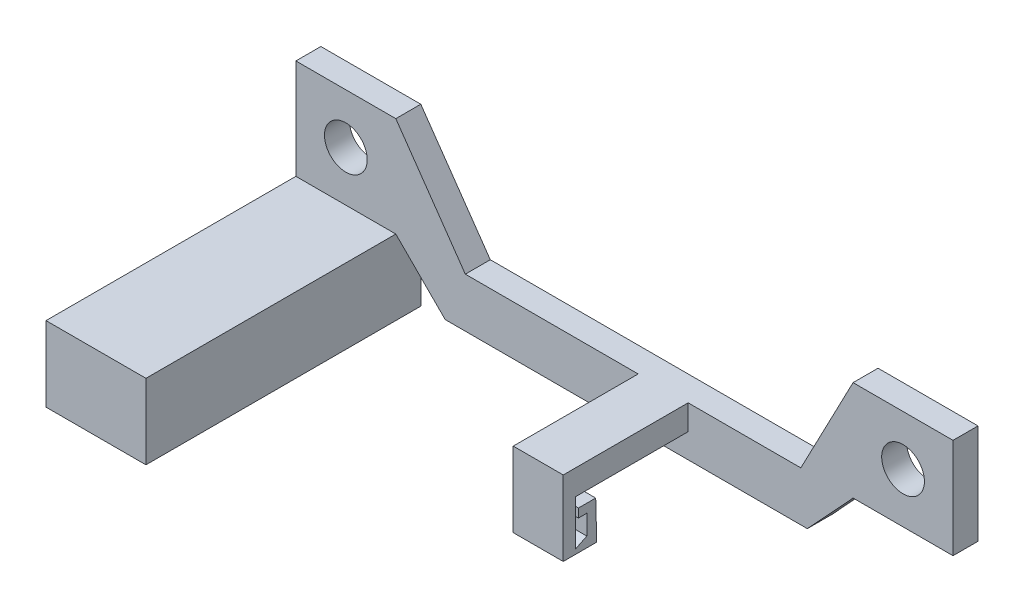
ISO-10303-21;
HEADER;
FILE_DESCRIPTION(('STEP AP214'),'2;1');
FILE_NAME('part.step','',(''),(''),'','','');
FILE_SCHEMA(('AUTOMOTIVE_DESIGN { 1 0 10303 214 1 1 1 1 }'));
ENDSEC;
DATA;
#1=APPLICATION_CONTEXT('core data for automotive mechanical design processes');
#2=APPLICATION_PROTOCOL_DEFINITION('international standard','automotive_design',2000,#1);
#3=PRODUCT_CONTEXT('',#1,'mechanical');
#4=PRODUCT('Part','Part','',(#3));
#5=PRODUCT_RELATED_PRODUCT_CATEGORY('part','',(#4));
#6=PRODUCT_DEFINITION_FORMATION('','',#4);
#7=PRODUCT_DEFINITION_CONTEXT('part definition',#1,'design');
#8=PRODUCT_DEFINITION('design','',#6,#7);
#9=PRODUCT_DEFINITION_SHAPE('','',#8);
#10=(LENGTH_UNIT() NAMED_UNIT(*) SI_UNIT(.MILLI.,.METRE.));
#11=(NAMED_UNIT(*) PLANE_ANGLE_UNIT() SI_UNIT($,.RADIAN.));
#12=(NAMED_UNIT(*) SI_UNIT($,.STERADIAN.) SOLID_ANGLE_UNIT());
#13=UNCERTAINTY_MEASURE_WITH_UNIT(LENGTH_MEASURE(1.E-05),#10,'distance_accuracy_value','');
#14=(GEOMETRIC_REPRESENTATION_CONTEXT(3) GLOBAL_UNCERTAINTY_ASSIGNED_CONTEXT((#13)) GLOBAL_UNIT_ASSIGNED_CONTEXT((#10,
#11,#12)) REPRESENTATION_CONTEXT('',''));
#15=CARTESIAN_POINT('',(0.,0.,0.));
#16=DIRECTION('',(0.,0.,1.));
#17=DIRECTION('',(1.,0.,0.));
#18=AXIS2_PLACEMENT_3D('',#15,#16,#17);
#19=CARTESIAN_POINT('',(0.,0.,2.54));
#20=DIRECTION('',(0.,0.,1.));
#21=DIRECTION('',(1.,0.,0.));
#22=AXIS2_PLACEMENT_3D('',#19,#20,#21);
#23=PLANE('',#22);
#24=CARTESIAN_POINT('',(56.642,0.,2.54));
#25=DIRECTION('',(0.,0.,1.));
#26=DIRECTION('',(1.,0.,0.));
#27=AXIS2_PLACEMENT_3D('',#24,#25,#26);
#28=CIRCLE('',#27,2.1717);
#29=CARTESIAN_POINT('',(58.8137,0.,2.54));
#30=VERTEX_POINT('',#29);
#31=EDGE_CURVE('E198',#30,#30,#28,.T.);
#32=ORIENTED_EDGE('',*,*,#31,.F.);
#33=EDGE_LOOP('',(#32));
#34=FACE_BOUND('',#33,.T.);
#35=CARTESIAN_POINT('',(0.,0.,2.54));
#36=DIRECTION('',(0.,0.,1.));
#37=DIRECTION('',(1.,0.,0.));
#38=AXIS2_PLACEMENT_3D('',#35,#36,#37);
#39=CIRCLE('',#38,2.1717);
#40=CARTESIAN_POINT('',(2.1717,0.,2.54));
#41=VERTEX_POINT('',#40);
#42=EDGE_CURVE('E292',#41,#41,#39,.T.);
#43=ORIENTED_EDGE('',*,*,#42,.F.);
#44=EDGE_LOOP('',(#43));
#45=FACE_BOUND('',#44,.T.);
#46=DIRECTION('',(1.,0.,0.));
#47=VECTOR('',#46,1.);
#48=CARTESIAN_POINT('',(0.,-5.08,2.54));
#49=LINE('',#48,#47);
#50=CARTESIAN_POINT('',(34.798,-5.08,2.54));
#51=VERTEX_POINT('',#50);
#52=CARTESIAN_POINT('',(46.2523899359759,-5.08,2.54));
#53=VERTEX_POINT('',#52);
#54=EDGE_CURVE('E241',#51,#53,#49,.T.);
#55=ORIENTED_EDGE('',*,*,#54,.F.);
#56=DIRECTION('',(0.,1.,0.));
#57=VECTOR('',#56,1.);
#58=CARTESIAN_POINT('',(34.798,0.,2.54));
#59=LINE('',#58,#57);
#60=CARTESIAN_POINT('',(34.798,-7.62,2.54));
#61=VERTEX_POINT('',#60);
#62=EDGE_CURVE('E469',#61,#51,#59,.T.);
#63=ORIENTED_EDGE('',*,*,#62,.F.);
#64=DIRECTION('',(1.,0.,0.));
#65=VECTOR('',#64,1.);
#66=CARTESIAN_POINT('',(0.,-7.62,2.54));
#67=LINE('',#66,#65);
#68=CARTESIAN_POINT('',(29.718,-7.62,2.54));
#69=VERTEX_POINT('',#68);
#70=EDGE_CURVE('E448',#69,#61,#67,.T.);
#71=ORIENTED_EDGE('',*,*,#70,.F.);
#72=DIRECTION('',(0.,-1.,0.));
#73=VECTOR('',#72,1.);
#74=CARTESIAN_POINT('',(29.718,0.,2.54));
#75=LINE('',#74,#73);
#76=CARTESIAN_POINT('',(29.718,-5.08,2.54));
#77=VERTEX_POINT('',#76);
#78=EDGE_CURVE('E465',#77,#69,#75,.T.);
#79=ORIENTED_EDGE('',*,*,#78,.F.);
#80=CARTESIAN_POINT('',(12.1453135079042,-5.08,2.54));
#81=VERTEX_POINT('',#80);
#82=EDGE_CURVE('E150',#81,#77,#49,.T.);
#83=ORIENTED_EDGE('',*,*,#82,.F.);
#84=DIRECTION('',(0.570927658436511,-0.821000370786885,0.));
#85=VECTOR('',#84,1.);
#86=CARTESIAN_POINT('',(5.80528901475342,4.03702626901824,2.54));
#87=LINE('',#86,#85);
#88=CARTESIAN_POINT('',(5.08,5.08,2.54));
#89=VERTEX_POINT('',#88);
#90=EDGE_CURVE('E133',#89,#81,#87,.T.);
#91=ORIENTED_EDGE('',*,*,#90,.F.);
#92=DIRECTION('',(1.,0.,0.));
#93=VECTOR('',#92,1.);
#94=CARTESIAN_POINT('',(0.,5.08,2.54));
#95=LINE('',#94,#93);
#96=CARTESIAN_POINT('',(-5.08,5.08,2.54));
#97=VERTEX_POINT('',#96);
#98=EDGE_CURVE('E147',#97,#89,#95,.T.);
#99=ORIENTED_EDGE('',*,*,#98,.F.);
#100=DIRECTION('',(0.,1.,0.));
#101=VECTOR('',#100,1.);
#102=CARTESIAN_POINT('',(-5.08,0.,2.54));
#103=LINE('',#102,#101);
#104=CARTESIAN_POINT('',(-5.08,-5.08,2.54));
#105=VERTEX_POINT('',#104);
#106=EDGE_CURVE('E153',#105,#97,#103,.T.);
#107=ORIENTED_EDGE('',*,*,#106,.F.);
#108=DIRECTION('',(-1.,0.,0.));
#109=VECTOR('',#108,1.);
#110=CARTESIAN_POINT('',(0.,-5.08,2.54));
#111=LINE('',#110,#109);
#112=CARTESIAN_POINT('',(5.08,-5.08,2.54));
#113=VERTEX_POINT('',#112);
#114=EDGE_CURVE('E155',#113,#105,#111,.T.);
#115=ORIENTED_EDGE('',*,*,#114,.F.);
#116=DIRECTION('',(0.707106781186556,-0.707106781186539,0.));
#117=VECTOR('',#116,1.);
#118=CARTESIAN_POINT('',(0.,0.,2.54));
#119=LINE('',#118,#117);
#120=CARTESIAN_POINT('',(10.102114398568,-10.1021143985678,2.54));
#121=VERTEX_POINT('',#120);
#122=EDGE_CURVE('E59',#113,#121,#119,.T.);
#123=ORIENTED_EDGE('',*,*,#122,.T.);
#124=DIRECTION('',(1.,0.,0.));
#125=VECTOR('',#124,1.);
#126=CARTESIAN_POINT('',(0.,-10.1021143985678,2.54));
#127=LINE('',#126,#125);
#128=CARTESIAN_POINT('',(46.9108277048577,-10.1021143985678,2.54));
#129=VERTEX_POINT('',#128);
#130=EDGE_CURVE('E234',#121,#129,#127,.T.);
#131=ORIENTED_EDGE('',*,*,#130,.T.);
#132=DIRECTION('',(0.679491903281779,0.733683006055412,0.));
#133=VECTOR('',#132,1.);
#134=CARTESIAN_POINT('',(30.2878886694219,-28.0507725387029,2.54));
#135=LINE('',#134,#133);
#136=CARTESIAN_POINT('',(51.562,-5.08,2.54));
#137=VERTEX_POINT('',#136);
#138=EDGE_CURVE('E107',#129,#137,#135,.T.);
#139=ORIENTED_EDGE('',*,*,#138,.T.);
#140=DIRECTION('',(-1.,0.,0.));
#141=VECTOR('',#140,1.);
#142=CARTESIAN_POINT('',(0.,-5.08000000000001,2.54));
#143=LINE('',#142,#141);
#144=CARTESIAN_POINT('',(61.722,-5.08,2.54));
#145=VERTEX_POINT('',#144);
#146=EDGE_CURVE('E216',#145,#137,#143,.T.);
#147=ORIENTED_EDGE('',*,*,#146,.F.);
#148=DIRECTION('',(0.,-1.,0.));
#149=VECTOR('',#148,1.);
#150=CARTESIAN_POINT('',(61.722,0.,2.54));
#151=LINE('',#150,#149);
#152=CARTESIAN_POINT('',(61.722,5.08,2.54));
#153=VERTEX_POINT('',#152);
#154=EDGE_CURVE('E228',#153,#145,#151,.T.);
#155=ORIENTED_EDGE('',*,*,#154,.F.);
#156=DIRECTION('',(1.,0.,0.));
#157=VECTOR('',#156,1.);
#158=CARTESIAN_POINT('',(0.,5.08,2.54));
#159=LINE('',#158,#157);
#160=CARTESIAN_POINT('',(51.562,5.08,2.54));
#161=VERTEX_POINT('',#160);
#162=EDGE_CURVE('E232',#161,#153,#159,.T.);
#163=ORIENTED_EDGE('',*,*,#162,.F.);
#164=DIRECTION('',(0.463165209084895,0.886271961134586,0.));
#165=VECTOR('',#164,1.);
#166=CARTESIAN_POINT('',(38.4155251556514,-20.0759310020882,2.54));
#167=LINE('',#166,#165);
#168=EDGE_CURVE('E239',#53,#161,#167,.T.);
#169=ORIENTED_EDGE('',*,*,#168,.F.);
#170=EDGE_LOOP('',(#55,#63,#71,#79,#83,#91,#99,#107,#115,#123,#131,#139,#147,#155,#163,#169));
#171=FACE_BOUND('',#170,.T.);
#172=ADVANCED_FACE('F35',(#34,#45,#171),#23,.T.);
#173=CARTESIAN_POINT('',(0.,-10.1021143985678,2.54));
#174=DIRECTION('',(0.,1.,0.));
#175=DIRECTION('',(0.,0.,1.));
#176=AXIS2_PLACEMENT_3D('',#173,#174,#175);
#177=PLANE('',#176);
#178=DIRECTION('',(1.,0.,0.));
#179=VECTOR('',#178,1.);
#180=CARTESIAN_POINT('',(0.,-10.1021143985678,0.));
#181=LINE('',#180,#179);
#182=CARTESIAN_POINT('',(10.102114398568,-10.1021143985678,0.));
#183=VERTEX_POINT('',#182);
#184=CARTESIAN_POINT('',(46.9108277048577,-10.1021143985678,0.));
#185=VERTEX_POINT('',#184);
#186=EDGE_CURVE('E170',#183,#185,#181,.T.);
#187=ORIENTED_EDGE('',*,*,#186,.T.);
#188=DIRECTION('',(0.,0.,-1.));
#189=VECTOR('',#188,1.);
#190=CARTESIAN_POINT('',(46.9108277048577,-10.1021143985678,2.54));
#191=LINE('',#190,#189);
#192=EDGE_CURVE('E11',#129,#185,#191,.T.);
#193=ORIENTED_EDGE('',*,*,#192,.F.);
#194=ORIENTED_EDGE('',*,*,#130,.F.);
#195=DIRECTION('',(0.,0.,-1.));
#196=VECTOR('',#195,1.);
#197=CARTESIAN_POINT('',(10.102114398568,-10.1021143985678,2.54));
#198=LINE('',#197,#196);
#199=EDGE_CURVE('E162',#121,#183,#198,.T.);
#200=ORIENTED_EDGE('',*,*,#199,.T.);
#201=EDGE_LOOP('',(#187,#193,#194,#200));
#202=FACE_BOUND('',#201,.T.);
#203=ADVANCED_FACE('F296',(#202),#177,.F.);
#204=CARTESIAN_POINT('',(30.2878886694219,-28.0507725387029,2.54));
#205=DIRECTION('',(-0.733683006055412,0.679491903281779,0.));
#206=DIRECTION('',(-0.679491903281779,-0.733683006055412,0.));
#207=AXIS2_PLACEMENT_3D('',#204,#205,#206);
#208=PLANE('',#207);
#209=DIRECTION('',(0.679491903281779,0.733683006055412,0.));
#210=VECTOR('',#209,1.);
#211=CARTESIAN_POINT('',(30.2878886694219,-28.0507725387029,0.));
#212=LINE('',#211,#210);
#213=CARTESIAN_POINT('',(51.562,-5.08,0.));
#214=VERTEX_POINT('',#213);
#215=EDGE_CURVE('E173',#185,#214,#212,.T.);
#216=ORIENTED_EDGE('',*,*,#215,.T.);
#217=DIRECTION('',(0.,0.,-1.));
#218=VECTOR('',#217,1.);
#219=CARTESIAN_POINT('',(51.562,-5.08,2.54));
#220=LINE('',#219,#218);
#221=EDGE_CURVE('E43',#137,#214,#220,.T.);
#222=ORIENTED_EDGE('',*,*,#221,.F.);
#223=ORIENTED_EDGE('',*,*,#138,.F.);
#224=ORIENTED_EDGE('',*,*,#192,.T.);
#225=EDGE_LOOP('',(#216,#222,#223,#224));
#226=FACE_BOUND('',#225,.T.);
#227=ADVANCED_FACE('F217',(#226),#208,.F.);
#228=CARTESIAN_POINT('',(0.,-5.08000000000001,2.54));
#229=DIRECTION('',(0.,-1.,0.));
#230=DIRECTION('',(1.,0.,0.));
#231=AXIS2_PLACEMENT_3D('',#228,#229,#230);
#232=PLANE('',#231);
#233=DIRECTION('',(-1.,0.,0.));
#234=VECTOR('',#233,1.);
#235=CARTESIAN_POINT('',(0.,-5.08000000000001,0.));
#236=LINE('',#235,#234);
#237=CARTESIAN_POINT('',(61.722,-5.08,0.));
#238=VERTEX_POINT('',#237);
#239=EDGE_CURVE('E176',#238,#214,#236,.T.);
#240=ORIENTED_EDGE('',*,*,#239,.F.);
#241=DIRECTION('',(0.,0.,-1.));
#242=VECTOR('',#241,1.);
#243=CARTESIAN_POINT('',(61.722,-5.08,2.54));
#244=LINE('',#243,#242);
#245=EDGE_CURVE('E210',#145,#238,#244,.T.);
#246=ORIENTED_EDGE('',*,*,#245,.F.);
#247=ORIENTED_EDGE('',*,*,#146,.T.);
#248=ORIENTED_EDGE('',*,*,#221,.T.);
#249=EDGE_LOOP('',(#240,#246,#247,#248));
#250=FACE_BOUND('',#249,.T.);
#251=ADVANCED_FACE('F214',(#250),#232,.T.);
#252=CARTESIAN_POINT('',(61.722,0.,2.54));
#253=DIRECTION('',(1.,0.,0.));
#254=DIRECTION('',(0.,0.,-1.));
#255=AXIS2_PLACEMENT_3D('',#252,#253,#254);
#256=PLANE('',#255);
#257=DIRECTION('',(0.,-1.,0.));
#258=VECTOR('',#257,1.);
#259=CARTESIAN_POINT('',(61.722,0.,0.));
#260=LINE('',#259,#258);
#261=CARTESIAN_POINT('',(61.722,5.08,0.));
#262=VERTEX_POINT('',#261);
#263=EDGE_CURVE('E179',#262,#238,#260,.T.);
#264=ORIENTED_EDGE('',*,*,#263,.F.);
#265=DIRECTION('',(0.,0.,-1.));
#266=VECTOR('',#265,1.);
#267=CARTESIAN_POINT('',(61.722,5.08,2.54));
#268=LINE('',#267,#266);
#269=EDGE_CURVE('E208',#153,#262,#268,.T.);
#270=ORIENTED_EDGE('',*,*,#269,.F.);
#271=ORIENTED_EDGE('',*,*,#154,.T.);
#272=ORIENTED_EDGE('',*,*,#245,.T.);
#273=EDGE_LOOP('',(#264,#270,#271,#272));
#274=FACE_BOUND('',#273,.T.);
#275=ADVANCED_FACE('F225',(#274),#256,.T.);
#276=CARTESIAN_POINT('',(0.,5.08,2.54));
#277=DIRECTION('',(0.,1.,0.));
#278=DIRECTION('',(0.,0.,1.));
#279=AXIS2_PLACEMENT_3D('',#276,#277,#278);
#280=PLANE('',#279);
#281=DIRECTION('',(1.,0.,0.));
#282=VECTOR('',#281,1.);
#283=CARTESIAN_POINT('',(0.,5.08,0.));
#284=LINE('',#283,#282);
#285=CARTESIAN_POINT('',(51.562,5.08,0.));
#286=VERTEX_POINT('',#285);
#287=EDGE_CURVE('E182',#286,#262,#284,.T.);
#288=ORIENTED_EDGE('',*,*,#287,.F.);
#289=DIRECTION('',(0.,0.,-1.));
#290=VECTOR('',#289,1.);
#291=CARTESIAN_POINT('',(51.562,5.08,2.54));
#292=LINE('',#291,#290);
#293=EDGE_CURVE('E206',#161,#286,#292,.T.);
#294=ORIENTED_EDGE('',*,*,#293,.F.);
#295=ORIENTED_EDGE('',*,*,#162,.T.);
#296=ORIENTED_EDGE('',*,*,#269,.T.);
#297=EDGE_LOOP('',(#288,#294,#295,#296));
#298=FACE_BOUND('',#297,.T.);
#299=ADVANCED_FACE('F257',(#298),#280,.T.);
#300=CARTESIAN_POINT('',(38.4155251556514,-20.0759310020882,2.54));
#301=DIRECTION('',(-0.886271961134586,0.463165209084895,0.));
#302=DIRECTION('',(-0.463165209084895,-0.886271961134586,0.));
#303=AXIS2_PLACEMENT_3D('',#300,#301,#302);
#304=PLANE('',#303);
#305=DIRECTION('',(0.463165209084895,0.886271961134586,0.));
#306=VECTOR('',#305,1.);
#307=CARTESIAN_POINT('',(38.4155251556514,-20.0759310020882,0.));
#308=LINE('',#307,#306);
#309=CARTESIAN_POINT('',(46.2523899359759,-5.08,0.));
#310=VERTEX_POINT('',#309);
#311=EDGE_CURVE('E185',#310,#286,#308,.T.);
#312=ORIENTED_EDGE('',*,*,#311,.F.);
#313=DIRECTION('',(0.,0.,-1.));
#314=VECTOR('',#313,1.);
#315=CARTESIAN_POINT('',(46.2523899359759,-5.08,2.54));
#316=LINE('',#315,#314);
#317=EDGE_CURVE('E204',#53,#310,#316,.T.);
#318=ORIENTED_EDGE('',*,*,#317,.F.);
#319=ORIENTED_EDGE('',*,*,#168,.T.);
#320=ORIENTED_EDGE('',*,*,#293,.T.);
#321=EDGE_LOOP('',(#312,#318,#319,#320));
#322=FACE_BOUND('',#321,.T.);
#323=ADVANCED_FACE('F255',(#322),#304,.T.);
#324=CARTESIAN_POINT('',(0.,-5.08,2.54));
#325=DIRECTION('',(0.,1.,0.));
#326=DIRECTION('',(-1.,0.,0.));
#327=AXIS2_PLACEMENT_3D('',#324,#325,#326);
#328=PLANE('',#327);
#329=DIRECTION('',(1.,0.,0.));
#330=VECTOR('',#329,1.);
#331=CARTESIAN_POINT('',(0.,-5.08,0.));
#332=LINE('',#331,#330);
#333=CARTESIAN_POINT('',(12.1453135079042,-5.08,0.));
#334=VERTEX_POINT('',#333);
#335=EDGE_CURVE('E188',#334,#310,#332,.T.);
#336=ORIENTED_EDGE('',*,*,#335,.F.);
#337=DIRECTION('',(0.,0.,-1.));
#338=VECTOR('',#337,1.);
#339=CARTESIAN_POINT('',(12.1453135079042,-5.08,2.54));
#340=LINE('',#339,#338);
#341=EDGE_CURVE('E140',#81,#334,#340,.T.);
#342=ORIENTED_EDGE('',*,*,#341,.F.);
#343=ORIENTED_EDGE('',*,*,#82,.T.);
#344=DIRECTION('',(0.,0.,-1.));
#345=VECTOR('',#344,1.);
#346=CARTESIAN_POINT('',(29.718,-5.08,15.24));
#347=LINE('',#346,#345);
#348=CARTESIAN_POINT('',(29.718,-5.08,15.24));
#349=VERTEX_POINT('',#348);
#350=EDGE_CURVE('E50',#349,#77,#347,.T.);
#351=ORIENTED_EDGE('',*,*,#350,.F.);
#352=DIRECTION('',(-1.,0.,0.));
#353=VECTOR('',#352,1.);
#354=CARTESIAN_POINT('',(0.,-5.08,15.24));
#355=LINE('',#354,#353);
#356=CARTESIAN_POINT('',(34.798,-5.08,15.24));
#357=VERTEX_POINT('',#356);
#358=EDGE_CURVE('E386',#357,#349,#355,.T.);
#359=ORIENTED_EDGE('',*,*,#358,.F.);
#360=DIRECTION('',(0.,0.,-1.));
#361=VECTOR('',#360,1.);
#362=CARTESIAN_POINT('',(34.798,-5.08,15.24));
#363=LINE('',#362,#361);
#364=EDGE_CURVE('E251',#357,#51,#363,.T.);
#365=ORIENTED_EDGE('',*,*,#364,.T.);
#366=ORIENTED_EDGE('',*,*,#54,.T.);
#367=ORIENTED_EDGE('',*,*,#317,.T.);
#368=EDGE_LOOP('',(#336,#342,#343,#351,#359,#365,#366,#367));
#369=FACE_BOUND('',#368,.T.);
#370=ADVANCED_FACE('F246',(#369),#328,.T.);
#371=CARTESIAN_POINT('',(5.80528901475342,4.03702626901824,2.54));
#372=DIRECTION('',(0.821000370786885,0.570927658436511,0.));
#373=DIRECTION('',(-0.570927658436511,0.821000370786885,0.));
#374=AXIS2_PLACEMENT_3D('',#371,#372,#373);
#375=PLANE('',#374);
#376=DIRECTION('',(0.570927658436511,-0.821000370786885,0.));
#377=VECTOR('',#376,1.);
#378=CARTESIAN_POINT('',(5.80528901475342,4.03702626901824,0.));
#379=LINE('',#378,#377);
#380=CARTESIAN_POINT('',(5.08,5.08,0.));
#381=VERTEX_POINT('',#380);
#382=EDGE_CURVE('E135',#381,#334,#379,.T.);
#383=ORIENTED_EDGE('',*,*,#382,.F.);
#384=DIRECTION('',(0.,0.,-1.));
#385=VECTOR('',#384,1.);
#386=CARTESIAN_POINT('',(5.08,5.08,2.54));
#387=LINE('',#386,#385);
#388=EDGE_CURVE('E130',#89,#381,#387,.T.);
#389=ORIENTED_EDGE('',*,*,#388,.F.);
#390=ORIENTED_EDGE('',*,*,#90,.T.);
#391=ORIENTED_EDGE('',*,*,#341,.T.);
#392=EDGE_LOOP('',(#383,#389,#390,#391));
#393=FACE_BOUND('',#392,.T.);
#394=ADVANCED_FACE('F132',(#393),#375,.T.);
#395=CARTESIAN_POINT('',(0.,5.08,2.54));
#396=DIRECTION('',(0.,1.,0.));
#397=DIRECTION('',(0.,0.,1.));
#398=AXIS2_PLACEMENT_3D('',#395,#396,#397);
#399=PLANE('',#398);
#400=DIRECTION('',(1.,0.,0.));
#401=VECTOR('',#400,1.);
#402=CARTESIAN_POINT('',(0.,5.08,0.));
#403=LINE('',#402,#401);
#404=CARTESIAN_POINT('',(-5.08,5.08,0.));
#405=VERTEX_POINT('',#404);
#406=EDGE_CURVE('E192',#405,#381,#403,.T.);
#407=ORIENTED_EDGE('',*,*,#406,.F.);
#408=DIRECTION('',(0.,0.,-1.));
#409=VECTOR('',#408,1.);
#410=CARTESIAN_POINT('',(-5.08,5.08,2.54));
#411=LINE('',#410,#409);
#412=EDGE_CURVE('E141',#97,#405,#411,.T.);
#413=ORIENTED_EDGE('',*,*,#412,.F.);
#414=ORIENTED_EDGE('',*,*,#98,.T.);
#415=ORIENTED_EDGE('',*,*,#388,.T.);
#416=EDGE_LOOP('',(#407,#413,#414,#415));
#417=FACE_BOUND('',#416,.T.);
#418=ADVANCED_FACE('F152',(#417),#399,.T.);
#419=CARTESIAN_POINT('',(-5.08,0.,2.54));
#420=DIRECTION('',(-1.,0.,0.));
#421=DIRECTION('',(0.,0.,1.));
#422=AXIS2_PLACEMENT_3D('',#419,#420,#421);
#423=PLANE('',#422);
#424=DIRECTION('',(0.,1.,0.));
#425=VECTOR('',#424,1.);
#426=CARTESIAN_POINT('',(-5.08,0.,0.));
#427=LINE('',#426,#425);
#428=CARTESIAN_POINT('',(-5.08,-12.7,0.));
#429=VERTEX_POINT('',#428);
#430=EDGE_CURVE('E194',#429,#405,#427,.T.);
#431=ORIENTED_EDGE('',*,*,#430,.F.);
#432=DIRECTION('',(0.,0.,1.));
#433=VECTOR('',#432,1.);
#434=CARTESIAN_POINT('',(-5.08,-12.7,0.));
#435=LINE('',#434,#433);
#436=CARTESIAN_POINT('',(-5.08,-12.7,27.94));
#437=VERTEX_POINT('',#436);
#438=EDGE_CURVE('E270',#429,#437,#435,.T.);
#439=ORIENTED_EDGE('',*,*,#438,.T.);
#440=DIRECTION('',(0.,-1.,0.));
#441=VECTOR('',#440,1.);
#442=CARTESIAN_POINT('',(-5.08,-5.08,27.94));
#443=LINE('',#442,#441);
#444=CARTESIAN_POINT('',(-5.08,-5.08,27.94));
#445=VERTEX_POINT('',#444);
#446=EDGE_CURVE('E480',#445,#437,#443,.T.);
#447=ORIENTED_EDGE('',*,*,#446,.F.);
#448=DIRECTION('',(0.,0.,1.));
#449=VECTOR('',#448,1.);
#450=CARTESIAN_POINT('',(-5.08,-5.08,0.));
#451=LINE('',#450,#449);
#452=EDGE_CURVE('E282',#105,#445,#451,.T.);
#453=ORIENTED_EDGE('',*,*,#452,.F.);
#454=ORIENTED_EDGE('',*,*,#106,.T.);
#455=ORIENTED_EDGE('',*,*,#412,.T.);
#456=EDGE_LOOP('',(#431,#439,#447,#453,#454,#455));
#457=FACE_BOUND('',#456,.T.);
#458=ADVANCED_FACE('F267',(#457),#423,.T.);
#459=CARTESIAN_POINT('',(0.,0.,2.54));
#460=DIRECTION('',(0.,0.,-1.));
#461=DIRECTION('',(-1.,0.,0.));
#462=AXIS2_PLACEMENT_3D('',#459,#460,#461);
#463=CYLINDRICAL_SURFACE('',#462,2.1717);
#464=ORIENTED_EDGE('',*,*,#42,.T.);
#465=EDGE_LOOP('',(#464));
#466=FACE_BOUND('',#465,.T.);
#467=CARTESIAN_POINT('',(0.,0.,0.));
#468=DIRECTION('',(0.,0.,1.));
#469=DIRECTION('',(1.,0.,0.));
#470=AXIS2_PLACEMENT_3D('',#467,#468,#469);
#471=CIRCLE('',#470,2.1717);
#472=CARTESIAN_POINT('',(2.1717,0.,0.));
#473=VERTEX_POINT('',#472);
#474=EDGE_CURVE('E166',#473,#473,#471,.T.);
#475=ORIENTED_EDGE('',*,*,#474,.F.);
#476=EDGE_LOOP('',(#475));
#477=FACE_BOUND('',#476,.T.);
#478=ADVANCED_FACE('F521',(#466,#477),#463,.F.);
#479=CARTESIAN_POINT('',(56.642,0.,2.54));
#480=DIRECTION('',(0.,0.,-1.));
#481=DIRECTION('',(-1.,0.,0.));
#482=AXIS2_PLACEMENT_3D('',#479,#480,#481);
#483=CYLINDRICAL_SURFACE('',#482,2.1717);
#484=ORIENTED_EDGE('',*,*,#31,.T.);
#485=EDGE_LOOP('',(#484));
#486=FACE_BOUND('',#485,.T.);
#487=CARTESIAN_POINT('',(56.642,0.,0.));
#488=DIRECTION('',(0.,0.,1.));
#489=DIRECTION('',(1.,0.,0.));
#490=AXIS2_PLACEMENT_3D('',#487,#488,#489);
#491=CIRCLE('',#490,2.1717);
#492=CARTESIAN_POINT('',(58.8137,0.,0.));
#493=VERTEX_POINT('',#492);
#494=EDGE_CURVE('E163',#493,#493,#491,.T.);
#495=ORIENTED_EDGE('',*,*,#494,.F.);
#496=EDGE_LOOP('',(#495));
#497=FACE_BOUND('',#496,.T.);
#498=ADVANCED_FACE('F37',(#486,#497),#483,.F.);
#499=CARTESIAN_POINT('',(0.,0.,2.54));
#500=DIRECTION('',(0.707106781186539,0.707106781186556,0.));
#501=DIRECTION('',(-0.707106781186556,0.707106781186539,0.));
#502=AXIS2_PLACEMENT_3D('',#499,#500,#501);
#503=PLANE('',#502);
#504=DIRECTION('',(0.707106781186556,-0.707106781186539,0.));
#505=VECTOR('',#504,1.);
#506=CARTESIAN_POINT('',(0.,0.,0.));
#507=LINE('',#506,#505);
#508=CARTESIAN_POINT('',(5.08,-5.08,0.));
#509=VERTEX_POINT('',#508);
#510=EDGE_CURVE('E99',#509,#183,#507,.T.);
#511=ORIENTED_EDGE('',*,*,#510,.T.);
#512=ORIENTED_EDGE('',*,*,#199,.F.);
#513=ORIENTED_EDGE('',*,*,#122,.F.);
#514=DIRECTION('',(0.,0.,-1.));
#515=VECTOR('',#514,1.);
#516=CARTESIAN_POINT('',(5.08,-5.08,2.54));
#517=LINE('',#516,#515);
#518=EDGE_CURVE('E200',#113,#509,#517,.T.);
#519=ORIENTED_EDGE('',*,*,#518,.T.);
#520=EDGE_LOOP('',(#511,#512,#513,#519));
#521=FACE_BOUND('',#520,.T.);
#522=ADVANCED_FACE('F503',(#521),#503,.F.);
#523=CARTESIAN_POINT('',(0.,0.,0.));
#524=DIRECTION('',(0.,0.,1.));
#525=DIRECTION('',(1.,0.,0.));
#526=AXIS2_PLACEMENT_3D('',#523,#524,#525);
#527=PLANE('',#526);
#528=ORIENTED_EDGE('',*,*,#494,.T.);
#529=EDGE_LOOP('',(#528));
#530=FACE_BOUND('',#529,.T.);
#531=ORIENTED_EDGE('',*,*,#474,.T.);
#532=EDGE_LOOP('',(#531));
#533=FACE_BOUND('',#532,.T.);
#534=ORIENTED_EDGE('',*,*,#186,.F.);
#535=ORIENTED_EDGE('',*,*,#510,.F.);
#536=DIRECTION('',(0.,1.,0.));
#537=VECTOR('',#536,1.);
#538=CARTESIAN_POINT('',(5.08,-12.7,0.));
#539=LINE('',#538,#537);
#540=CARTESIAN_POINT('',(5.08,-12.7,0.));
#541=VERTEX_POINT('',#540);
#542=EDGE_CURVE('E286',#541,#509,#539,.T.);
#543=ORIENTED_EDGE('',*,*,#542,.F.);
#544=DIRECTION('',(1.,0.,0.));
#545=VECTOR('',#544,1.);
#546=CARTESIAN_POINT('',(-5.08,-12.7,0.));
#547=LINE('',#546,#545);
#548=EDGE_CURVE('E263',#429,#541,#547,.T.);
#549=ORIENTED_EDGE('',*,*,#548,.F.);
#550=ORIENTED_EDGE('',*,*,#430,.T.);
#551=ORIENTED_EDGE('',*,*,#406,.T.);
#552=ORIENTED_EDGE('',*,*,#382,.T.);
#553=ORIENTED_EDGE('',*,*,#335,.T.);
#554=ORIENTED_EDGE('',*,*,#311,.T.);
#555=ORIENTED_EDGE('',*,*,#287,.T.);
#556=ORIENTED_EDGE('',*,*,#263,.T.);
#557=ORIENTED_EDGE('',*,*,#239,.T.);
#558=ORIENTED_EDGE('',*,*,#215,.F.);
#559=EDGE_LOOP('',(#534,#535,#543,#549,#550,#551,#552,#553,#554,#555,#556,#557,#558));
#560=FACE_BOUND('',#559,.T.);
#561=ADVANCED_FACE('F221',(#530,#533,#560),#527,.F.);
#562=CARTESIAN_POINT('',(5.08,-5.08,0.));
#563=DIRECTION('',(0.,1.,0.));
#564=DIRECTION('',(-1.,0.,0.));
#565=AXIS2_PLACEMENT_3D('',#562,#563,#564);
#566=PLANE('',#565);
#567=DIRECTION('',(0.,0.,1.));
#568=VECTOR('',#567,1.);
#569=CARTESIAN_POINT('',(5.08,-5.08,0.));
#570=LINE('',#569,#568);
#571=CARTESIAN_POINT('',(5.08,-5.08,27.94));
#572=VERTEX_POINT('',#571);
#573=EDGE_CURVE('E167',#113,#572,#570,.T.);
#574=ORIENTED_EDGE('',*,*,#573,.F.);
#575=ORIENTED_EDGE('',*,*,#114,.T.);
#576=ORIENTED_EDGE('',*,*,#452,.T.);
#577=DIRECTION('',(-1.,0.,0.));
#578=VECTOR('',#577,1.);
#579=CARTESIAN_POINT('',(5.08,-5.08,27.94));
#580=LINE('',#579,#578);
#581=EDGE_CURVE('E477',#572,#445,#580,.T.);
#582=ORIENTED_EDGE('',*,*,#581,.F.);
#583=EDGE_LOOP('',(#574,#575,#576,#582));
#584=FACE_BOUND('',#583,.T.);
#585=ADVANCED_FACE('F494',(#584),#566,.T.);
#586=CARTESIAN_POINT('',(5.08,-12.7,0.));
#587=DIRECTION('',(1.,0.,0.));
#588=DIRECTION('',(0.,1.,0.));
#589=AXIS2_PLACEMENT_3D('',#586,#587,#588);
#590=PLANE('',#589);
#591=ORIENTED_EDGE('',*,*,#518,.F.);
#592=ORIENTED_EDGE('',*,*,#573,.T.);
#593=DIRECTION('',(0.,1.,0.));
#594=VECTOR('',#593,1.);
#595=CARTESIAN_POINT('',(5.08,-12.7,27.94));
#596=LINE('',#595,#594);
#597=CARTESIAN_POINT('',(5.08,-12.7,27.94));
#598=VERTEX_POINT('',#597);
#599=EDGE_CURVE('E483',#598,#572,#596,.T.);
#600=ORIENTED_EDGE('',*,*,#599,.F.);
#601=DIRECTION('',(0.,0.,1.));
#602=VECTOR('',#601,1.);
#603=CARTESIAN_POINT('',(5.08,-12.7,0.));
#604=LINE('',#603,#602);
#605=EDGE_CURVE('E281',#541,#598,#604,.T.);
#606=ORIENTED_EDGE('',*,*,#605,.F.);
#607=ORIENTED_EDGE('',*,*,#542,.T.);
#608=EDGE_LOOP('',(#591,#592,#600,#606,#607));
#609=FACE_BOUND('',#608,.T.);
#610=ADVANCED_FACE('F489',(#609),#590,.T.);
#611=CARTESIAN_POINT('',(-5.08,-12.7,0.));
#612=DIRECTION('',(0.,-1.,0.));
#613=DIRECTION('',(0.,0.,-1.));
#614=AXIS2_PLACEMENT_3D('',#611,#612,#613);
#615=PLANE('',#614);
#616=ORIENTED_EDGE('',*,*,#605,.T.);
#617=DIRECTION('',(1.,0.,0.));
#618=VECTOR('',#617,1.);
#619=CARTESIAN_POINT('',(-5.08,-12.7,27.94));
#620=LINE('',#619,#618);
#621=EDGE_CURVE('E280',#437,#598,#620,.T.);
#622=ORIENTED_EDGE('',*,*,#621,.F.);
#623=ORIENTED_EDGE('',*,*,#438,.F.);
#624=ORIENTED_EDGE('',*,*,#548,.T.);
#625=EDGE_LOOP('',(#616,#622,#623,#624));
#626=FACE_BOUND('',#625,.T.);
#627=ADVANCED_FACE('F278',(#626),#615,.T.);
#628=CARTESIAN_POINT('',(0.,0.,27.94));
#629=DIRECTION('',(0.,0.,1.));
#630=DIRECTION('',(1.,0.,0.));
#631=AXIS2_PLACEMENT_3D('',#628,#629,#630);
#632=PLANE('',#631);
#633=ORIENTED_EDGE('',*,*,#581,.T.);
#634=ORIENTED_EDGE('',*,*,#446,.T.);
#635=ORIENTED_EDGE('',*,*,#621,.T.);
#636=ORIENTED_EDGE('',*,*,#599,.T.);
#637=EDGE_LOOP('',(#633,#634,#635,#636));
#638=FACE_BOUND('',#637,.T.);
#639=ADVANCED_FACE('F493',(#638),#632,.T.);
#640=CARTESIAN_POINT('',(0.,-7.62,15.24));
#641=DIRECTION('',(0.,1.,0.));
#642=DIRECTION('',(0.,0.,1.));
#643=AXIS2_PLACEMENT_3D('',#640,#641,#642);
#644=PLANE('',#643);
#645=DIRECTION('',(0.,0.,-1.));
#646=VECTOR('',#645,1.);
#647=CARTESIAN_POINT('',(34.798,-7.62,15.24));
#648=LINE('',#647,#646);
#649=CARTESIAN_POINT('',(34.798,-7.62,13.97));
#650=VERTEX_POINT('',#649);
#651=EDGE_CURVE('E475',#650,#61,#648,.T.);
#652=ORIENTED_EDGE('',*,*,#651,.F.);
#653=DIRECTION('',(1.,0.,0.));
#654=VECTOR('',#653,1.);
#655=CARTESIAN_POINT('',(29.718,-7.62,13.97));
#656=LINE('',#655,#654);
#657=CARTESIAN_POINT('',(29.718,-7.62,13.97));
#658=VERTEX_POINT('',#657);
#659=EDGE_CURVE('E446',#658,#650,#656,.T.);
#660=ORIENTED_EDGE('',*,*,#659,.F.);
#661=DIRECTION('',(0.,0.,-1.));
#662=VECTOR('',#661,1.);
#663=CARTESIAN_POINT('',(29.718,-7.62,15.24));
#664=LINE('',#663,#662);
#665=EDGE_CURVE('E388',#658,#69,#664,.T.);
#666=ORIENTED_EDGE('',*,*,#665,.T.);
#667=ORIENTED_EDGE('',*,*,#70,.T.);
#668=EDGE_LOOP('',(#652,#660,#666,#667));
#669=FACE_BOUND('',#668,.T.);
#670=ADVANCED_FACE('F587',(#669),#644,.F.);
#671=CARTESIAN_POINT('',(34.798,0.,15.24));
#672=DIRECTION('',(-1.,0.,0.));
#673=DIRECTION('',(0.,0.,1.));
#674=AXIS2_PLACEMENT_3D('',#671,#672,#673);
#675=PLANE('',#674);
#676=ORIENTED_EDGE('',*,*,#62,.T.);
#677=ORIENTED_EDGE('',*,*,#364,.F.);
#678=DIRECTION('',(0.,1.,0.));
#679=VECTOR('',#678,1.);
#680=CARTESIAN_POINT('',(34.798,0.,15.24));
#681=LINE('',#680,#679);
#682=CARTESIAN_POINT('',(34.798,-12.7,15.24));
#683=VERTEX_POINT('',#682);
#684=EDGE_CURVE('E463',#683,#357,#681,.T.);
#685=ORIENTED_EDGE('',*,*,#684,.F.);
#686=DIRECTION('',(0.,0.,-1.));
#687=VECTOR('',#686,1.);
#688=CARTESIAN_POINT('',(34.798,-12.7,13.97));
#689=LINE('',#688,#687);
#690=CARTESIAN_POINT('',(34.798,-12.7,11.8348309771044));
#691=VERTEX_POINT('',#690);
#692=EDGE_CURVE('E396',#683,#691,#689,.T.);
#693=ORIENTED_EDGE('',*,*,#692,.T.);
#694=DIRECTION('',(0.,0.999656763233435,0.0261983915851907));
#695=VECTOR('',#694,1.);
#696=CARTESIAN_POINT('',(34.798,-8.76336094494781,11.938));
#697=LINE('',#696,#695);
#698=CARTESIAN_POINT('',(34.798,-8.76336094494781,11.938));
#699=VERTEX_POINT('',#698);
#700=EDGE_CURVE('E429',#691,#699,#697,.T.);
#701=ORIENTED_EDGE('',*,*,#700,.T.);
#702=DIRECTION('',(0.,0.,1.));
#703=VECTOR('',#702,1.);
#704=CARTESIAN_POINT('',(34.798,-8.76336094494781,13.6931991144991));
#705=LINE('',#704,#703);
#706=CARTESIAN_POINT('',(34.798,-8.76336094494781,13.6931991144991));
#707=VERTEX_POINT('',#706);
#708=EDGE_CURVE('E432',#699,#707,#705,.T.);
#709=ORIENTED_EDGE('',*,*,#708,.T.);
#710=DIRECTION('',(0.,-1.,0.));
#711=VECTOR('',#710,1.);
#712=CARTESIAN_POINT('',(34.798,-9.64641521267726,13.6931991144991));
#713=LINE('',#712,#711);
#714=CARTESIAN_POINT('',(34.798,-9.64641521267726,13.6931991144991));
#715=VERTEX_POINT('',#714);
#716=EDGE_CURVE('E435',#707,#715,#713,.T.);
#717=ORIENTED_EDGE('',*,*,#716,.T.);
#718=DIRECTION('',(0.,0.,-1.));
#719=VECTOR('',#718,1.);
#720=CARTESIAN_POINT('',(34.798,-9.64641521267726,12.8411223955567));
#721=LINE('',#720,#719);
#722=CARTESIAN_POINT('',(34.798,-9.64641521267726,12.8411223955567));
#723=VERTEX_POINT('',#722);
#724=EDGE_CURVE('E438',#715,#723,#721,.T.);
#725=ORIENTED_EDGE('',*,*,#724,.T.);
#726=DIRECTION('',(0.,-1.,0.));
#727=VECTOR('',#726,1.);
#728=CARTESIAN_POINT('',(34.798,-9.64641521267726,12.8411223955567));
#729=LINE('',#728,#727);
#730=CARTESIAN_POINT('',(34.798,-11.6585113662005,12.8411223955567));
#731=VERTEX_POINT('',#730);
#732=EDGE_CURVE('E441',#723,#731,#729,.T.);
#733=ORIENTED_EDGE('',*,*,#732,.T.);
#734=DIRECTION('',(0.,-0.442691634071035,0.896673919060612));
#735=VECTOR('',#734,1.);
#736=CARTESIAN_POINT('',(34.798,-11.6585113662005,12.8411223955567));
#737=LINE('',#736,#735);
#738=CARTESIAN_POINT('',(34.798,-12.2158429231401,13.97));
#739=VERTEX_POINT('',#738);
#740=EDGE_CURVE('E410',#731,#739,#737,.T.);
#741=ORIENTED_EDGE('',*,*,#740,.T.);
#742=DIRECTION('',(0.,1.,0.));
#743=VECTOR('',#742,1.);
#744=CARTESIAN_POINT('',(34.798,-9.64641521267726,13.97));
#745=LINE('',#744,#743);
#746=EDGE_CURVE('E405',#739,#650,#745,.T.);
#747=ORIENTED_EDGE('',*,*,#746,.T.);
#748=ORIENTED_EDGE('',*,*,#651,.T.);
#749=EDGE_LOOP('',(#676,#677,#685,#693,#701,#709,#717,#725,#733,#741,#747,#748));
#750=FACE_BOUND('',#749,.T.);
#751=ADVANCED_FACE('F608',(#750),#675,.F.);
#752=CARTESIAN_POINT('',(29.718,0.,15.24));
#753=DIRECTION('',(1.,0.,0.));
#754=DIRECTION('',(0.,0.,-1.));
#755=AXIS2_PLACEMENT_3D('',#752,#753,#754);
#756=PLANE('',#755);
#757=ORIENTED_EDGE('',*,*,#78,.T.);
#758=ORIENTED_EDGE('',*,*,#665,.F.);
#759=DIRECTION('',(0.,1.,0.));
#760=VECTOR('',#759,1.);
#761=CARTESIAN_POINT('',(29.718,-12.2158429231401,13.97));
#762=LINE('',#761,#760);
#763=CARTESIAN_POINT('',(29.718,-12.2158429231401,13.97));
#764=VERTEX_POINT('',#763);
#765=EDGE_CURVE('E398',#764,#658,#762,.T.);
#766=ORIENTED_EDGE('',*,*,#765,.F.);
#767=DIRECTION('',(0.,-0.442691634071035,0.896673919060612));
#768=VECTOR('',#767,1.);
#769=CARTESIAN_POINT('',(29.718,-11.6585113662005,12.8411223955567));
#770=LINE('',#769,#768);
#771=CARTESIAN_POINT('',(29.718,-11.6585113662005,12.8411223955567));
#772=VERTEX_POINT('',#771);
#773=EDGE_CURVE('E424',#772,#764,#770,.T.);
#774=ORIENTED_EDGE('',*,*,#773,.F.);
#775=DIRECTION('',(0.,-1.,0.));
#776=VECTOR('',#775,1.);
#777=CARTESIAN_POINT('',(29.718,-9.64641521267726,12.8411223955567));
#778=LINE('',#777,#776);
#779=CARTESIAN_POINT('',(29.718,-9.64641521267726,12.8411223955567));
#780=VERTEX_POINT('',#779);
#781=EDGE_CURVE('E421',#780,#772,#778,.T.);
#782=ORIENTED_EDGE('',*,*,#781,.F.);
#783=DIRECTION('',(0.,0.,-1.));
#784=VECTOR('',#783,1.);
#785=CARTESIAN_POINT('',(29.718,-9.64641521267726,12.8411223955567));
#786=LINE('',#785,#784);
#787=CARTESIAN_POINT('',(29.718,-9.64641521267726,13.6931991144991));
#788=VERTEX_POINT('',#787);
#789=EDGE_CURVE('E418',#788,#780,#786,.T.);
#790=ORIENTED_EDGE('',*,*,#789,.F.);
#791=DIRECTION('',(0.,-1.,0.));
#792=VECTOR('',#791,1.);
#793=CARTESIAN_POINT('',(29.718,-9.64641521267726,13.6931991144991));
#794=LINE('',#793,#792);
#795=CARTESIAN_POINT('',(29.718,-8.76336094494781,13.6931991144991));
#796=VERTEX_POINT('',#795);
#797=EDGE_CURVE('E415',#796,#788,#794,.T.);
#798=ORIENTED_EDGE('',*,*,#797,.F.);
#799=DIRECTION('',(0.,0.,1.));
#800=VECTOR('',#799,1.);
#801=CARTESIAN_POINT('',(29.718,-8.76336094494781,13.6931991144991));
#802=LINE('',#801,#800);
#803=CARTESIAN_POINT('',(29.718,-8.76336094494781,11.938));
#804=VERTEX_POINT('',#803);
#805=EDGE_CURVE('E407',#804,#796,#802,.T.);
#806=ORIENTED_EDGE('',*,*,#805,.F.);
#807=DIRECTION('',(0.,0.999656763233435,0.0261983915851907));
#808=VECTOR('',#807,1.);
#809=CARTESIAN_POINT('',(29.718,-8.76336094494781,11.938));
#810=LINE('',#809,#808);
#811=CARTESIAN_POINT('',(29.718,-12.7,11.8348309771044));
#812=VERTEX_POINT('',#811);
#813=EDGE_CURVE('E404',#812,#804,#810,.T.);
#814=ORIENTED_EDGE('',*,*,#813,.F.);
#815=DIRECTION('',(0.,0.,-1.));
#816=VECTOR('',#815,1.);
#817=CARTESIAN_POINT('',(29.718,-12.7,15.24));
#818=LINE('',#817,#816);
#819=CARTESIAN_POINT('',(29.718,-12.7,15.24));
#820=VERTEX_POINT('',#819);
#821=EDGE_CURVE('E393',#820,#812,#818,.T.);
#822=ORIENTED_EDGE('',*,*,#821,.F.);
#823=DIRECTION('',(0.,-1.,0.));
#824=VECTOR('',#823,1.);
#825=CARTESIAN_POINT('',(29.718,0.,15.24));
#826=LINE('',#825,#824);
#827=EDGE_CURVE('E382',#349,#820,#826,.T.);
#828=ORIENTED_EDGE('',*,*,#827,.F.);
#829=ORIENTED_EDGE('',*,*,#350,.T.);
#830=EDGE_LOOP('',(#757,#758,#766,#774,#782,#790,#798,#806,#814,#822,#828,#829));
#831=FACE_BOUND('',#830,.T.);
#832=ADVANCED_FACE('F401',(#831),#756,.F.);
#833=CARTESIAN_POINT('',(0.,0.,15.24));
#834=DIRECTION('',(0.,0.,1.));
#835=DIRECTION('',(1.,0.,0.));
#836=AXIS2_PLACEMENT_3D('',#833,#834,#835);
#837=PLANE('',#836);
#838=ORIENTED_EDGE('',*,*,#827,.T.);
#839=DIRECTION('',(1.,0.,0.));
#840=VECTOR('',#839,1.);
#841=CARTESIAN_POINT('',(29.718,-12.7,15.24));
#842=LINE('',#841,#840);
#843=EDGE_CURVE('E385',#820,#683,#842,.T.);
#844=ORIENTED_EDGE('',*,*,#843,.T.);
#845=ORIENTED_EDGE('',*,*,#684,.T.);
#846=ORIENTED_EDGE('',*,*,#358,.T.);
#847=EDGE_LOOP('',(#838,#844,#845,#846));
#848=FACE_BOUND('',#847,.T.);
#849=ADVANCED_FACE('F384',(#848),#837,.T.);
#850=CARTESIAN_POINT('',(29.718,-9.64641521267726,13.97));
#851=DIRECTION('',(0.,0.,-1.));
#852=DIRECTION('',(-1.,0.,0.));
#853=AXIS2_PLACEMENT_3D('',#850,#851,#852);
#854=PLANE('',#853);
#855=ORIENTED_EDGE('',*,*,#746,.F.);
#856=DIRECTION('',(1.,0.,0.));
#857=VECTOR('',#856,1.);
#858=CARTESIAN_POINT('',(29.718,-12.2158429231401,13.97));
#859=LINE('',#858,#857);
#860=EDGE_CURVE('E449',#764,#739,#859,.T.);
#861=ORIENTED_EDGE('',*,*,#860,.F.);
#862=ORIENTED_EDGE('',*,*,#765,.T.);
#863=ORIENTED_EDGE('',*,*,#659,.T.);
#864=EDGE_LOOP('',(#855,#861,#862,#863));
#865=FACE_BOUND('',#864,.T.);
#866=ADVANCED_FACE('F638',(#865),#854,.T.);
#867=CARTESIAN_POINT('',(29.718,-11.6585113662005,12.8411223955567));
#868=DIRECTION('',(0.,0.896673919060612,0.442691634071035));
#869=DIRECTION('',(0.,-0.442691634071035,0.896673919060612));
#870=AXIS2_PLACEMENT_3D('',#867,#868,#869);
#871=PLANE('',#870);
#872=ORIENTED_EDGE('',*,*,#740,.F.);
#873=DIRECTION('',(1.,0.,0.));
#874=VECTOR('',#873,1.);
#875=CARTESIAN_POINT('',(29.718,-11.6585113662005,12.8411223955567));
#876=LINE('',#875,#874);
#877=EDGE_CURVE('E452',#772,#731,#876,.T.);
#878=ORIENTED_EDGE('',*,*,#877,.F.);
#879=ORIENTED_EDGE('',*,*,#773,.T.);
#880=ORIENTED_EDGE('',*,*,#860,.T.);
#881=EDGE_LOOP('',(#872,#878,#879,#880));
#882=FACE_BOUND('',#881,.T.);
#883=ADVANCED_FACE('F648',(#882),#871,.T.);
#884=CARTESIAN_POINT('',(29.718,-9.64641521267726,12.8411223955567));
#885=DIRECTION('',(0.,0.,1.));
#886=DIRECTION('',(1.,0.,0.));
#887=AXIS2_PLACEMENT_3D('',#884,#885,#886);
#888=PLANE('',#887);
#889=ORIENTED_EDGE('',*,*,#732,.F.);
#890=DIRECTION('',(1.,0.,0.));
#891=VECTOR('',#890,1.);
#892=CARTESIAN_POINT('',(29.718,-9.64641521267726,12.8411223955567));
#893=LINE('',#892,#891);
#894=EDGE_CURVE('E454',#780,#723,#893,.T.);
#895=ORIENTED_EDGE('',*,*,#894,.F.);
#896=ORIENTED_EDGE('',*,*,#781,.T.);
#897=ORIENTED_EDGE('',*,*,#877,.T.);
#898=EDGE_LOOP('',(#889,#895,#896,#897));
#899=FACE_BOUND('',#898,.T.);
#900=ADVANCED_FACE('F658',(#899),#888,.T.);
#901=CARTESIAN_POINT('',(29.718,-9.64641521267726,12.8411223955567));
#902=DIRECTION('',(0.,-1.,0.));
#903=DIRECTION('',(0.,0.,-1.));
#904=AXIS2_PLACEMENT_3D('',#901,#902,#903);
#905=PLANE('',#904);
#906=ORIENTED_EDGE('',*,*,#724,.F.);
#907=DIRECTION('',(1.,0.,0.));
#908=VECTOR('',#907,1.);
#909=CARTESIAN_POINT('',(29.718,-9.64641521267726,13.6931991144991));
#910=LINE('',#909,#908);
#911=EDGE_CURVE('E456',#788,#715,#910,.T.);
#912=ORIENTED_EDGE('',*,*,#911,.F.);
#913=ORIENTED_EDGE('',*,*,#789,.T.);
#914=ORIENTED_EDGE('',*,*,#894,.T.);
#915=EDGE_LOOP('',(#906,#912,#913,#914));
#916=FACE_BOUND('',#915,.T.);
#917=ADVANCED_FACE('F668',(#916),#905,.T.);
#918=CARTESIAN_POINT('',(29.718,-9.64641521267726,13.6931991144991));
#919=DIRECTION('',(0.,0.,1.));
#920=DIRECTION('',(1.,0.,0.));
#921=AXIS2_PLACEMENT_3D('',#918,#919,#920);
#922=PLANE('',#921);
#923=ORIENTED_EDGE('',*,*,#716,.F.);
#924=DIRECTION('',(1.,0.,0.));
#925=VECTOR('',#924,1.);
#926=CARTESIAN_POINT('',(29.718,-8.76336094494781,13.6931991144991));
#927=LINE('',#926,#925);
#928=EDGE_CURVE('E458',#796,#707,#927,.T.);
#929=ORIENTED_EDGE('',*,*,#928,.F.);
#930=ORIENTED_EDGE('',*,*,#797,.T.);
#931=ORIENTED_EDGE('',*,*,#911,.T.);
#932=EDGE_LOOP('',(#923,#929,#930,#931));
#933=FACE_BOUND('',#932,.T.);
#934=ADVANCED_FACE('F678',(#933),#922,.T.);
#935=CARTESIAN_POINT('',(29.718,-8.76336094494781,13.6931991144991));
#936=DIRECTION('',(0.,1.,0.));
#937=DIRECTION('',(0.,0.,1.));
#938=AXIS2_PLACEMENT_3D('',#935,#936,#937);
#939=PLANE('',#938);
#940=ORIENTED_EDGE('',*,*,#708,.F.);
#941=DIRECTION('',(1.,0.,0.));
#942=VECTOR('',#941,1.);
#943=CARTESIAN_POINT('',(29.718,-8.76336094494781,11.938));
#944=LINE('',#943,#942);
#945=EDGE_CURVE('E460',#804,#699,#944,.T.);
#946=ORIENTED_EDGE('',*,*,#945,.F.);
#947=ORIENTED_EDGE('',*,*,#805,.T.);
#948=ORIENTED_EDGE('',*,*,#928,.T.);
#949=EDGE_LOOP('',(#940,#946,#947,#948));
#950=FACE_BOUND('',#949,.T.);
#951=ADVANCED_FACE('F688',(#950),#939,.T.);
#952=CARTESIAN_POINT('',(29.718,-8.76336094494781,11.938));
#953=DIRECTION('',(0.,0.0261983915851907,-0.999656763233436));
#954=DIRECTION('',(0.,0.999656763233436,0.0261983915851907));
#955=AXIS2_PLACEMENT_3D('',#952,#953,#954);
#956=PLANE('',#955);
#957=ORIENTED_EDGE('',*,*,#700,.F.);
#958=DIRECTION('',(1.,0.,0.));
#959=VECTOR('',#958,1.);
#960=CARTESIAN_POINT('',(29.718,-12.7,11.8348309771044));
#961=LINE('',#960,#959);
#962=EDGE_CURVE('E397',#812,#691,#961,.T.);
#963=ORIENTED_EDGE('',*,*,#962,.F.);
#964=ORIENTED_EDGE('',*,*,#813,.T.);
#965=ORIENTED_EDGE('',*,*,#945,.T.);
#966=EDGE_LOOP('',(#957,#963,#964,#965));
#967=FACE_BOUND('',#966,.T.);
#968=ADVANCED_FACE('F698',(#967),#956,.T.);
#969=CARTESIAN_POINT('',(29.718,-12.7,13.97));
#970=DIRECTION('',(0.,-1.,0.));
#971=DIRECTION('',(0.,0.,-1.));
#972=AXIS2_PLACEMENT_3D('',#969,#970,#971);
#973=PLANE('',#972);
#974=ORIENTED_EDGE('',*,*,#692,.F.);
#975=ORIENTED_EDGE('',*,*,#843,.F.);
#976=ORIENTED_EDGE('',*,*,#821,.T.);
#977=ORIENTED_EDGE('',*,*,#962,.T.);
#978=EDGE_LOOP('',(#974,#975,#976,#977));
#979=FACE_BOUND('',#978,.T.);
#980=ADVANCED_FACE('F392',(#979),#973,.T.);
#981=CLOSED_SHELL('',(#172,#203,#227,#251,#275,#299,#323,#370,#394,#418,#458,#478,#498,#522,
#561,#585,#610,#627,#639,#670,#751,#832,#849,#866,#883,#900,#917,#934,#951,#968,#980));
#982=MANIFOLD_SOLID_BREP('B2',#981);
#983=ADVANCED_BREP_SHAPE_REPRESENTATION('',(#18,#982),#14);
#984=SHAPE_DEFINITION_REPRESENTATION(#9,#983);
ENDSEC;
END-ISO-10303-21;
